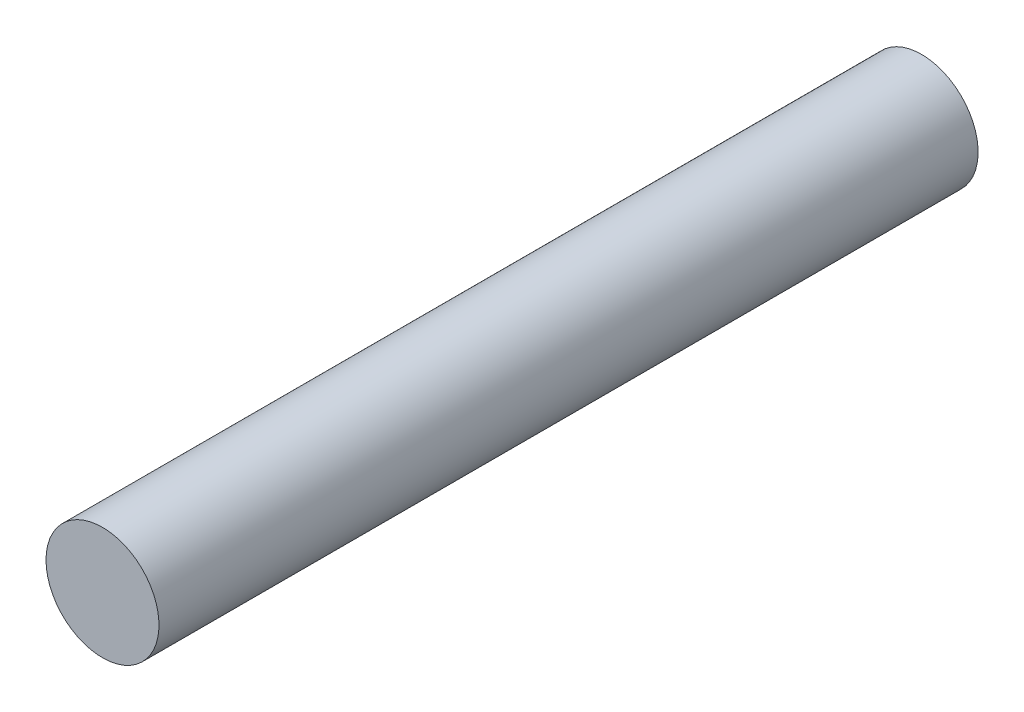
ISO-10303-21;
HEADER;
FILE_DESCRIPTION(('STEP AP214'),'2;1');
FILE_NAME('part.step','',(''),(''),'','','');
FILE_SCHEMA(('AUTOMOTIVE_DESIGN { 1 0 10303 214 1 1 1 1 }'));
ENDSEC;
DATA;
#1=APPLICATION_CONTEXT('core data for automotive mechanical design processes');
#2=APPLICATION_PROTOCOL_DEFINITION('international standard','automotive_design',2000,#1);
#3=PRODUCT_CONTEXT('',#1,'mechanical');
#4=PRODUCT('Part','Part','',(#3));
#5=PRODUCT_RELATED_PRODUCT_CATEGORY('part','',(#4));
#6=PRODUCT_DEFINITION_FORMATION('','',#4);
#7=PRODUCT_DEFINITION_CONTEXT('part definition',#1,'design');
#8=PRODUCT_DEFINITION('design','',#6,#7);
#9=PRODUCT_DEFINITION_SHAPE('','',#8);
#10=(LENGTH_UNIT() NAMED_UNIT(*) SI_UNIT(.MILLI.,.METRE.));
#11=(NAMED_UNIT(*) PLANE_ANGLE_UNIT() SI_UNIT($,.RADIAN.));
#12=(NAMED_UNIT(*) SI_UNIT($,.STERADIAN.) SOLID_ANGLE_UNIT());
#13=UNCERTAINTY_MEASURE_WITH_UNIT(LENGTH_MEASURE(1.E-05),#10,'distance_accuracy_value','');
#14=(GEOMETRIC_REPRESENTATION_CONTEXT(3) GLOBAL_UNCERTAINTY_ASSIGNED_CONTEXT((#13)) GLOBAL_UNIT_ASSIGNED_CONTEXT((#10,
#11,#12)) REPRESENTATION_CONTEXT('',''));
#15=CARTESIAN_POINT('',(0.,0.,0.));
#16=DIRECTION('',(0.,0.,1.));
#17=DIRECTION('',(1.,0.,0.));
#18=AXIS2_PLACEMENT_3D('',#15,#16,#17);
#19=CARTESIAN_POINT('',(0.,0.,29.));
#20=DIRECTION('',(0.,0.,-1.));
#21=DIRECTION('',(-1.,0.,0.));
#22=AXIS2_PLACEMENT_3D('',#19,#20,#21);
#23=CYLINDRICAL_SURFACE('',#22,4.);
#24=CARTESIAN_POINT('',(0.,0.,29.));
#25=DIRECTION('',(0.,0.,1.));
#26=DIRECTION('',(1.,0.,0.));
#27=AXIS2_PLACEMENT_3D('',#24,#25,#26);
#28=CIRCLE('',#27,4.);
#29=CARTESIAN_POINT('',(-4.,0.,29.));
#30=VERTEX_POINT('',#29);
#31=EDGE_CURVE('E10',#30,#30,#28,.T.);
#32=CARTESIAN_POINT('',(0.,0.,-29.));
#33=DIRECTION('',(0.,0.,1.));
#34=DIRECTION('',(1.,0.,0.));
#35=AXIS2_PLACEMENT_3D('',#32,#33,#34);
#36=CIRCLE('',#35,4.);
#37=CARTESIAN_POINT('',(-4.,0.,-29.));
#38=VERTEX_POINT('',#37);
#39=EDGE_CURVE('E33',#38,#38,#36,.T.);
#40=CARTESIAN_POINT('',(-4.,0.,29.));
#41=CARTESIAN_POINT('',(-4.,0.,28.3958333333333));
#42=CARTESIAN_POINT('',(-4.,0.,27.7916666666667));
#43=CARTESIAN_POINT('',(-4.,0.,26.5833333333333));
#44=CARTESIAN_POINT('',(-4.,0.,25.9791666666667));
#45=CARTESIAN_POINT('',(-4.,0.,24.7708333333333));
#46=CARTESIAN_POINT('',(-4.,0.,24.1666666666667));
#47=CARTESIAN_POINT('',(-4.,0.,22.9583333333333));
#48=CARTESIAN_POINT('',(-4.,0.,22.3541666666667));
#49=CARTESIAN_POINT('',(-4.,0.,21.1458333333333));
#50=CARTESIAN_POINT('',(-4.,0.,20.5416666666667));
#51=CARTESIAN_POINT('',(-4.,0.,19.3333333333333));
#52=CARTESIAN_POINT('',(-4.,0.,18.7291666666667));
#53=CARTESIAN_POINT('',(-4.,0.,17.5208333333333));
#54=CARTESIAN_POINT('',(-4.,0.,16.9166666666667));
#55=CARTESIAN_POINT('',(-4.,0.,15.7083333333333));
#56=CARTESIAN_POINT('',(-4.,0.,15.1041666666667));
#57=CARTESIAN_POINT('',(-4.,0.,13.8958333333333));
#58=CARTESIAN_POINT('',(-4.,0.,13.2916666666667));
#59=CARTESIAN_POINT('',(-4.,0.,12.0833333333333));
#60=CARTESIAN_POINT('',(-4.,0.,11.4791666666667));
#61=CARTESIAN_POINT('',(-4.,0.,10.2708333333333));
#62=CARTESIAN_POINT('',(-4.,0.,9.66666666666667));
#63=CARTESIAN_POINT('',(-4.,0.,8.45833333333333));
#64=CARTESIAN_POINT('',(-4.,0.,7.85416666666666));
#65=CARTESIAN_POINT('',(-4.,0.,6.64583333333333));
#66=CARTESIAN_POINT('',(-4.,0.,6.04166666666666));
#67=CARTESIAN_POINT('',(-4.,0.,4.83333333333333));
#68=CARTESIAN_POINT('',(-4.,0.,4.22916666666666));
#69=CARTESIAN_POINT('',(-4.,0.,3.02083333333333));
#70=CARTESIAN_POINT('',(-4.,0.,2.41666666666666));
#71=CARTESIAN_POINT('',(-4.,0.,1.20833333333333));
#72=CARTESIAN_POINT('',(-4.,0.,0.604166666666664));
#73=CARTESIAN_POINT('',(-4.,0.,-0.604166666666671));
#74=CARTESIAN_POINT('',(-4.,0.,-1.20833333333334));
#75=CARTESIAN_POINT('',(-4.,0.,-2.41666666666667));
#76=CARTESIAN_POINT('',(-4.,0.,-3.02083333333333));
#77=CARTESIAN_POINT('',(-4.,0.,-4.22916666666667));
#78=CARTESIAN_POINT('',(-4.,0.,-4.83333333333333));
#79=CARTESIAN_POINT('',(-4.,0.,-6.04166666666666));
#80=CARTESIAN_POINT('',(-4.,0.,-6.64583333333333));
#81=CARTESIAN_POINT('',(-4.,0.,-7.85416666666666));
#82=CARTESIAN_POINT('',(-4.,0.,-8.45833333333333));
#83=CARTESIAN_POINT('',(-4.,0.,-9.66666666666667));
#84=CARTESIAN_POINT('',(-4.,0.,-10.2708333333333));
#85=CARTESIAN_POINT('',(-4.,0.,-11.4791666666667));
#86=CARTESIAN_POINT('',(-4.,0.,-12.0833333333333));
#87=CARTESIAN_POINT('',(-4.,0.,-13.2916666666667));
#88=CARTESIAN_POINT('',(-4.,0.,-13.8958333333333));
#89=CARTESIAN_POINT('',(-4.,0.,-15.1041666666667));
#90=CARTESIAN_POINT('',(-4.,0.,-15.7083333333333));
#91=CARTESIAN_POINT('',(-4.,0.,-16.9166666666667));
#92=CARTESIAN_POINT('',(-4.,0.,-17.5208333333333));
#93=CARTESIAN_POINT('',(-4.,0.,-18.7291666666667));
#94=CARTESIAN_POINT('',(-4.,0.,-19.3333333333333));
#95=CARTESIAN_POINT('',(-4.,0.,-20.5416666666667));
#96=CARTESIAN_POINT('',(-4.,0.,-21.1458333333333));
#97=CARTESIAN_POINT('',(-4.,0.,-22.3541666666667));
#98=CARTESIAN_POINT('',(-4.,0.,-22.9583333333333));
#99=CARTESIAN_POINT('',(-4.,0.,-24.1666666666667));
#100=CARTESIAN_POINT('',(-4.,0.,-24.7708333333333));
#101=CARTESIAN_POINT('',(-4.,0.,-25.9791666666667));
#102=CARTESIAN_POINT('',(-4.,0.,-26.5833333333333));
#103=CARTESIAN_POINT('',(-4.,0.,-27.7916666666667));
#104=CARTESIAN_POINT('',(-4.,0.,-28.3958333333333));
#105=CARTESIAN_POINT('',(-4.,0.,-29.));
#106=B_SPLINE_CURVE_WITH_KNOTS('',3,(#40,#41,#42,#43,#44,#45,#46,#47,#48,#49,#50,#51,#52,#53,
#54,#55,#56,#57,#58,#59,#60,#61,#62,#63,#64,#65,#66,#67,#68,#69,#70,#71,#72,#73,#74,#75,#76,#77,
#78,#79,#80,#81,#82,#83,#84,#85,#86,#87,#88,#89,#90,#91,#92,#93,#94,#95,#96,#97,#98,#99,#100,
#101,#102,#103,#104,#105),.UNSPECIFIED.,.F.,.F.,(4,2,2,2,2,2,2,2,2,2,2,2,2,2,2,2,2,2,2,2,2,2,2,
2,2,2,2,2,2,2,2,2,4),(0.,1.8125,3.625,5.4375,7.25,9.0625,10.875,12.6875,14.5,16.3125,18.125,
19.9375,21.75,23.5625,25.375,27.1875,29.,30.8125,32.625,34.4375,36.25,38.0625,39.875,41.6875,
43.5,45.3125,47.125,48.9375,50.75,52.5625,54.375,56.1875,58.),.UNSPECIFIED.);
#107=EDGE_CURVE('BSEAM30',#30,#38,#106,.T.);
#108=ORIENTED_EDGE('',*,*,#31,.F.);
#109=ORIENTED_EDGE('',*,*,#39,.T.);
#110=ORIENTED_EDGE('',*,*,#107,.T.);
#111=ORIENTED_EDGE('',*,*,#107,.F.);
#112=EDGE_LOOP('',(#108,#110,#109,#111));
#113=FACE_BOUND('',#112,.T.);
#114=ADVANCED_FACE('F30',(#113),#23,.T.);
#115=CARTESIAN_POINT('',(0.,0.,29.));
#116=DIRECTION('',(0.,0.,1.));
#117=DIRECTION('',(1.,0.,0.));
#118=AXIS2_PLACEMENT_3D('',#115,#116,#117);
#119=PLANE('',#118);
#120=ORIENTED_EDGE('',*,*,#31,.T.);
#121=EDGE_LOOP('',(#120));
#122=FACE_BOUND('',#121,.T.);
#123=ADVANCED_FACE('F45',(#122),#119,.T.);
#124=CARTESIAN_POINT('',(0.,0.,-29.));
#125=DIRECTION('',(0.,0.,1.));
#126=DIRECTION('',(1.,0.,0.));
#127=AXIS2_PLACEMENT_3D('',#124,#125,#126);
#128=PLANE('',#127);
#129=ORIENTED_EDGE('',*,*,#39,.F.);
#130=EDGE_LOOP('',(#129));
#131=FACE_BOUND('',#130,.T.);
#132=ADVANCED_FACE('F43',(#131),#128,.F.);
#133=CLOSED_SHELL('',(#114,#123,#132));
#134=MANIFOLD_SOLID_BREP('B2',#133);
#135=ADVANCED_BREP_SHAPE_REPRESENTATION('',(#18,#134),#14);
#136=SHAPE_DEFINITION_REPRESENTATION(#9,#135);
ENDSEC;
END-ISO-10303-21;
